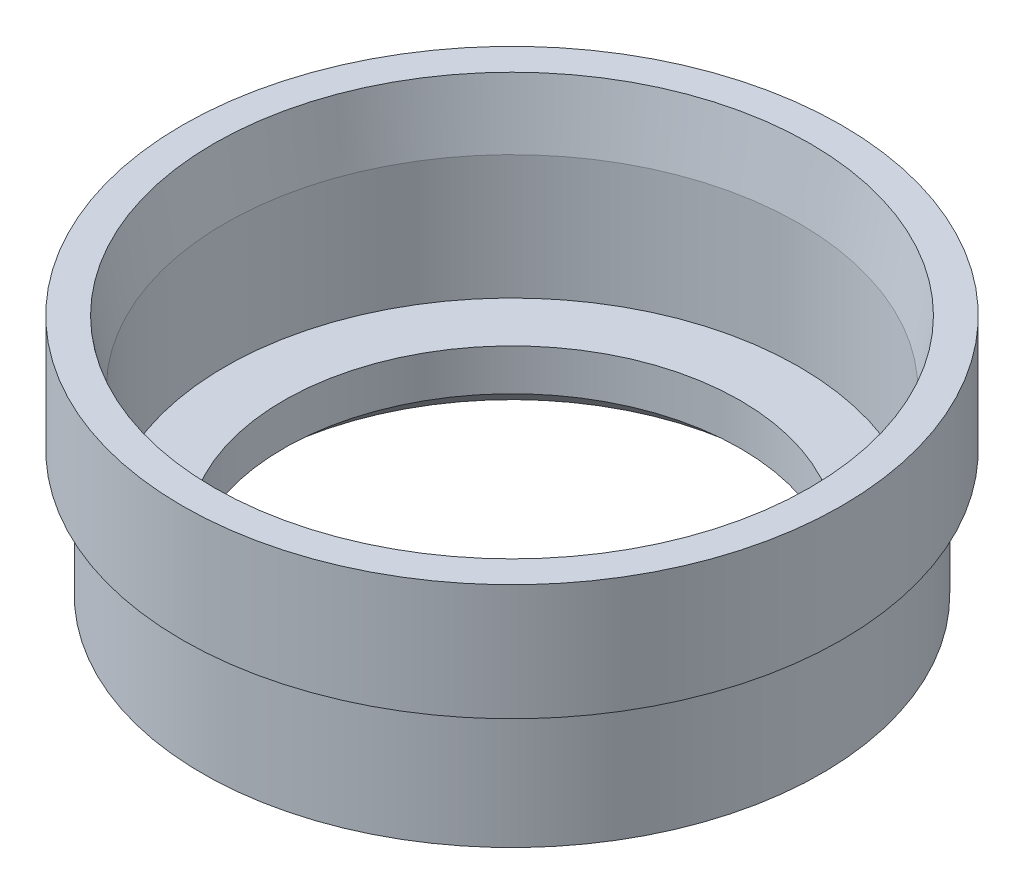
ISO-10303-21;
HEADER;
FILE_DESCRIPTION(('STEP AP214'),'2;1');
FILE_NAME('part.step','',(''),(''),'','','');
FILE_SCHEMA(('AUTOMOTIVE_DESIGN { 1 0 10303 214 1 1 1 1 }'));
ENDSEC;
DATA;
#1=APPLICATION_CONTEXT('core data for automotive mechanical design processes');
#2=APPLICATION_PROTOCOL_DEFINITION('international standard','automotive_design',2000,#1);
#3=PRODUCT_CONTEXT('',#1,'mechanical');
#4=PRODUCT('Part','Part','',(#3));
#5=PRODUCT_RELATED_PRODUCT_CATEGORY('part','',(#4));
#6=PRODUCT_DEFINITION_FORMATION('','',#4);
#7=PRODUCT_DEFINITION_CONTEXT('part definition',#1,'design');
#8=PRODUCT_DEFINITION('design','',#6,#7);
#9=PRODUCT_DEFINITION_SHAPE('','',#8);
#10=(LENGTH_UNIT() NAMED_UNIT(*) SI_UNIT(.MILLI.,.METRE.));
#11=(NAMED_UNIT(*) PLANE_ANGLE_UNIT() SI_UNIT($,.RADIAN.));
#12=(NAMED_UNIT(*) SI_UNIT($,.STERADIAN.) SOLID_ANGLE_UNIT());
#13=UNCERTAINTY_MEASURE_WITH_UNIT(LENGTH_MEASURE(1.E-05),#10,'distance_accuracy_value','');
#14=(GEOMETRIC_REPRESENTATION_CONTEXT(3) GLOBAL_UNCERTAINTY_ASSIGNED_CONTEXT((#13)) GLOBAL_UNIT_ASSIGNED_CONTEXT((#10,
#11,#12)) REPRESENTATION_CONTEXT('',''));
#15=CARTESIAN_POINT('',(0.,0.,0.));
#16=DIRECTION('',(0.,0.,1.));
#17=DIRECTION('',(1.,0.,0.));
#18=AXIS2_PLACEMENT_3D('',#15,#16,#17);
#19=CARTESIAN_POINT('',(0.,24.0144133538924,0.));
#20=DIRECTION('',(0.,-1.,0.));
#21=DIRECTION('',(0.,0.,-1.));
#22=AXIS2_PLACEMENT_3D('',#19,#20,#21);
#23=PLANE('',#22);
#24=CARTESIAN_POINT('',(-18.7,24.0144133538924,0.));
#25=DIRECTION('',(0.,-1.,0.));
#26=DIRECTION('',(0.,0.,-1.));
#27=AXIS2_PLACEMENT_3D('',#24,#25,#26);
#28=CIRCLE('',#27,27.);
#29=CARTESIAN_POINT('',(-18.7,24.0144133538924,-27.));
#30=VERTEX_POINT('',#29);
#31=EDGE_CURVE('E76',#30,#30,#28,.T.);
#32=ORIENTED_EDGE('',*,*,#31,.F.);
#33=EDGE_LOOP('',(#32));
#34=FACE_BOUND('',#33,.T.);
#35=CARTESIAN_POINT('',(-18.7,24.0144133538924,0.));
#36=DIRECTION('',(0.,-1.,0.));
#37=DIRECTION('',(0.,0.,-1.));
#38=AXIS2_PLACEMENT_3D('',#35,#36,#37);
#39=CIRCLE('',#38,24.4058882382235);
#40=CARTESIAN_POINT('',(-18.7,24.0144133538924,-24.4058882382235));
#41=VERTEX_POINT('',#40);
#42=EDGE_CURVE('E10',#41,#41,#39,.T.);
#43=ORIENTED_EDGE('',*,*,#42,.T.);
#44=EDGE_LOOP('',(#43));
#45=FACE_BOUND('',#44,.T.);
#46=ADVANCED_FACE('F36',(#34,#45),#23,.F.);
#47=CARTESIAN_POINT('',(-18.7,18.8102771556521,0.));
#48=DIRECTION('',(0.,1.,0.));
#49=DIRECTION('',(0.,0.,1.));
#50=AXIS2_PLACEMENT_3D('',#47,#48,#49);
#51=CONICAL_SURFACE('',#50,23.5,0.172343951786383);
#52=ORIENTED_EDGE('',*,*,#42,.F.);
#53=EDGE_LOOP('',(#52));
#54=FACE_BOUND('',#53,.T.);
#55=CARTESIAN_POINT('',(-18.7,18.8102771556521,0.));
#56=DIRECTION('',(0.,-1.,0.));
#57=DIRECTION('',(0.,0.,-1.));
#58=AXIS2_PLACEMENT_3D('',#55,#56,#57);
#59=CIRCLE('',#58,23.5);
#60=CARTESIAN_POINT('',(-18.7,18.8102771556521,-23.5));
#61=VERTEX_POINT('',#60);
#62=EDGE_CURVE('E42',#61,#61,#59,.T.);
#63=ORIENTED_EDGE('',*,*,#62,.T.);
#64=EDGE_LOOP('',(#63));
#65=FACE_BOUND('',#64,.T.);
#66=ADVANCED_FACE('F84',(#54,#65),#51,.F.);
#67=CARTESIAN_POINT('',(-18.7,7.43621261128227,0.));
#68=DIRECTION('',(0.,-1.,0.));
#69=DIRECTION('',(0.,0.,-1.));
#70=AXIS2_PLACEMENT_3D('',#67,#68,#69);
#71=CYLINDRICAL_SURFACE('',#70,23.5);
#72=ORIENTED_EDGE('',*,*,#62,.F.);
#73=EDGE_LOOP('',(#72));
#74=FACE_BOUND('',#73,.T.);
#75=CARTESIAN_POINT('',(-18.7,8.63946186812493,0.));
#76=DIRECTION('',(0.,-1.,0.));
#77=DIRECTION('',(0.,0.,-1.));
#78=AXIS2_PLACEMENT_3D('',#75,#76,#77);
#79=CIRCLE('',#78,23.5);
#80=CARTESIAN_POINT('',(-18.7,8.63946186812493,-23.5));
#81=VERTEX_POINT('',#80);
#82=EDGE_CURVE('E46',#81,#81,#79,.T.);
#83=ORIENTED_EDGE('',*,*,#82,.T.);
#84=EDGE_LOOP('',(#83));
#85=FACE_BOUND('',#84,.T.);
#86=ADVANCED_FACE('F88',(#74,#85),#71,.F.);
#87=CARTESIAN_POINT('',(0.,8.63946186812493,0.));
#88=DIRECTION('',(0.,-1.,0.));
#89=DIRECTION('',(0.,0.,-1.));
#90=AXIS2_PLACEMENT_3D('',#87,#88,#89);
#91=PLANE('',#90);
#92=ORIENTED_EDGE('',*,*,#82,.F.);
#93=EDGE_LOOP('',(#92));
#94=FACE_BOUND('',#93,.T.);
#95=CARTESIAN_POINT('',(-18.7,8.63946186812493,0.));
#96=DIRECTION('',(0.,-1.,0.));
#97=DIRECTION('',(0.,0.,-1.));
#98=AXIS2_PLACEMENT_3D('',#95,#96,#97);
#99=CIRCLE('',#98,18.7);
#100=CARTESIAN_POINT('',(-18.7,8.63946186812493,-18.7));
#101=VERTEX_POINT('',#100);
#102=EDGE_CURVE('E50',#101,#101,#99,.T.);
#103=ORIENTED_EDGE('',*,*,#102,.T.);
#104=EDGE_LOOP('',(#103));
#105=FACE_BOUND('',#104,.T.);
#106=ADVANCED_FACE('F93',(#94,#105),#91,.F.);
#107=CARTESIAN_POINT('',(-18.7,7.43621261128227,0.));
#108=DIRECTION('',(0.,-1.,0.));
#109=DIRECTION('',(0.,0.,-1.));
#110=AXIS2_PLACEMENT_3D('',#107,#108,#109);
#111=CYLINDRICAL_SURFACE('',#110,18.7);
#112=ORIENTED_EDGE('',*,*,#102,.F.);
#113=EDGE_LOOP('',(#112));
#114=FACE_BOUND('',#113,.T.);
#115=CARTESIAN_POINT('',(-18.7,5.24558964556921,0.));
#116=DIRECTION('',(0.,-1.,0.));
#117=DIRECTION('',(0.,0.,-1.));
#118=AXIS2_PLACEMENT_3D('',#115,#116,#117);
#119=CIRCLE('',#118,18.7);
#120=CARTESIAN_POINT('',(-18.7,5.24558964556921,-18.7));
#121=VERTEX_POINT('',#120);
#122=EDGE_CURVE('E55',#121,#121,#119,.T.);
#123=ORIENTED_EDGE('',*,*,#122,.T.);
#124=EDGE_LOOP('',(#123));
#125=FACE_BOUND('',#124,.T.);
#126=ADVANCED_FACE('F99',(#114,#125),#111,.F.);
#127=CARTESIAN_POINT('',(-18.7,3.20559711810254,0.));
#128=DIRECTION('',(0.,-1.,0.));
#129=DIRECTION('',(0.,0.,-1.));
#130=AXIS2_PLACEMENT_3D('',#127,#128,#129);
#131=CONICAL_SURFACE('',#130,20.9961701868477,0.844408917222406);
#132=ORIENTED_EDGE('',*,*,#122,.F.);
#133=EDGE_LOOP('',(#132));
#134=FACE_BOUND('',#133,.T.);
#135=CARTESIAN_POINT('',(-18.7,3.20559711810254,0.));
#136=DIRECTION('',(0.,-1.,0.));
#137=DIRECTION('',(0.,0.,-1.));
#138=AXIS2_PLACEMENT_3D('',#135,#136,#137);
#139=CIRCLE('',#138,20.9961701868477);
#140=CARTESIAN_POINT('',(-18.7,3.20559711810254,-20.9961701868477));
#141=VERTEX_POINT('',#140);
#142=EDGE_CURVE('E58',#141,#141,#139,.T.);
#143=ORIENTED_EDGE('',*,*,#142,.T.);
#144=EDGE_LOOP('',(#143));
#145=FACE_BOUND('',#144,.T.);
#146=ADVANCED_FACE('F103',(#134,#145),#131,.F.);
#147=CARTESIAN_POINT('',(0.,3.20559711810254,0.));
#148=DIRECTION('',(0.,1.,0.));
#149=DIRECTION('',(0.,0.,1.));
#150=AXIS2_PLACEMENT_3D('',#147,#148,#149);
#151=PLANE('',#150);
#152=ORIENTED_EDGE('',*,*,#142,.F.);
#153=EDGE_LOOP('',(#152));
#154=FACE_BOUND('',#153,.T.);
#155=CARTESIAN_POINT('',(-18.7,3.20559711810254,0.));
#156=DIRECTION('',(0.,-1.,0.));
#157=DIRECTION('',(0.,0.,-1.));
#158=AXIS2_PLACEMENT_3D('',#155,#156,#157);
#159=CIRCLE('',#158,22.4961701868477);
#160=CARTESIAN_POINT('',(-18.7,3.20559711810254,-22.4961701868477));
#161=VERTEX_POINT('',#160);
#162=EDGE_CURVE('E61',#161,#161,#159,.T.);
#163=ORIENTED_EDGE('',*,*,#162,.T.);
#164=EDGE_LOOP('',(#163));
#165=FACE_BOUND('',#164,.T.);
#166=ADVANCED_FACE('F107',(#154,#165),#151,.F.);
#167=CARTESIAN_POINT('',(-18.7,7.43621261128227,0.));
#168=DIRECTION('',(0.,-1.,0.));
#169=DIRECTION('',(0.,0.,-1.));
#170=AXIS2_PLACEMENT_3D('',#167,#168,#169);
#171=CYLINDRICAL_SURFACE('',#170,22.4961701868477);
#172=ORIENTED_EDGE('',*,*,#162,.F.);
#173=EDGE_LOOP('',(#172));
#174=FACE_BOUND('',#173,.T.);
#175=CARTESIAN_POINT('',(-18.7,4.20559711810254,0.));
#176=DIRECTION('',(0.,-1.,0.));
#177=DIRECTION('',(0.,0.,-1.));
#178=AXIS2_PLACEMENT_3D('',#175,#176,#177);
#179=CIRCLE('',#178,22.4961701868477);
#180=CARTESIAN_POINT('',(-18.7,4.20559711810254,-22.4961701868477));
#181=VERTEX_POINT('',#180);
#182=EDGE_CURVE('E64',#181,#181,#179,.T.);
#183=ORIENTED_EDGE('',*,*,#182,.T.);
#184=EDGE_LOOP('',(#183));
#185=FACE_BOUND('',#184,.T.);
#186=ADVANCED_FACE('F111',(#174,#185),#171,.T.);
#187=CARTESIAN_POINT('',(0.,4.20559711810254,0.));
#188=DIRECTION('',(0.,1.,0.));
#189=DIRECTION('',(0.,0.,1.));
#190=AXIS2_PLACEMENT_3D('',#187,#188,#189);
#191=PLANE('',#190);
#192=ORIENTED_EDGE('',*,*,#182,.F.);
#193=EDGE_LOOP('',(#192));
#194=FACE_BOUND('',#193,.T.);
#195=CARTESIAN_POINT('',(-18.7,4.20559711810254,0.));
#196=DIRECTION('',(0.,-1.,0.));
#197=DIRECTION('',(0.,0.,-1.));
#198=AXIS2_PLACEMENT_3D('',#195,#196,#197);
#199=CIRCLE('',#198,25.35);
#200=CARTESIAN_POINT('',(-18.7,4.20559711810254,-25.35));
#201=VERTEX_POINT('',#200);
#202=EDGE_CURVE('E67',#201,#201,#199,.T.);
#203=ORIENTED_EDGE('',*,*,#202,.T.);
#204=EDGE_LOOP('',(#203));
#205=FACE_BOUND('',#204,.T.);
#206=ADVANCED_FACE('F115',(#194,#205),#191,.F.);
#207=CARTESIAN_POINT('',(-18.7,7.43621261128227,0.));
#208=DIRECTION('',(0.,-1.,0.));
#209=DIRECTION('',(0.,0.,-1.));
#210=AXIS2_PLACEMENT_3D('',#207,#208,#209);
#211=CYLINDRICAL_SURFACE('',#210,25.35);
#212=ORIENTED_EDGE('',*,*,#202,.F.);
#213=EDGE_LOOP('',(#212));
#214=FACE_BOUND('',#213,.T.);
#215=CARTESIAN_POINT('',(-18.7,14.5055971181025,0.));
#216=DIRECTION('',(0.,-1.,0.));
#217=DIRECTION('',(0.,0.,-1.));
#218=AXIS2_PLACEMENT_3D('',#215,#216,#217);
#219=CIRCLE('',#218,25.35);
#220=CARTESIAN_POINT('',(-18.7,14.5055971181025,-25.35));
#221=VERTEX_POINT('',#220);
#222=EDGE_CURVE('E70',#221,#221,#219,.T.);
#223=ORIENTED_EDGE('',*,*,#222,.T.);
#224=EDGE_LOOP('',(#223));
#225=FACE_BOUND('',#224,.T.);
#226=ADVANCED_FACE('F119',(#214,#225),#211,.T.);
#227=CARTESIAN_POINT('',(0.,14.5055971181025,0.));
#228=DIRECTION('',(0.,-1.,0.));
#229=DIRECTION('',(0.,0.,-1.));
#230=AXIS2_PLACEMENT_3D('',#227,#228,#229);
#231=PLANE('',#230);
#232=CARTESIAN_POINT('',(-18.7,14.5055971181025,0.));
#233=DIRECTION('',(0.,-1.,0.));
#234=DIRECTION('',(0.,0.,-1.));
#235=AXIS2_PLACEMENT_3D('',#232,#233,#234);
#236=CIRCLE('',#235,27.);
#237=CARTESIAN_POINT('',(-18.7,14.5055971181025,-27.));
#238=VERTEX_POINT('',#237);
#239=EDGE_CURVE('E73',#238,#238,#236,.T.);
#240=ORIENTED_EDGE('',*,*,#239,.T.);
#241=EDGE_LOOP('',(#240));
#242=FACE_BOUND('',#241,.T.);
#243=ORIENTED_EDGE('',*,*,#222,.F.);
#244=EDGE_LOOP('',(#243));
#245=FACE_BOUND('',#244,.T.);
#246=ADVANCED_FACE('F123',(#242,#245),#231,.T.);
#247=CARTESIAN_POINT('',(-18.7,7.43621261128227,0.));
#248=DIRECTION('',(0.,-1.,0.));
#249=DIRECTION('',(0.,0.,-1.));
#250=AXIS2_PLACEMENT_3D('',#247,#248,#249);
#251=CYLINDRICAL_SURFACE('',#250,27.);
#252=ORIENTED_EDGE('',*,*,#31,.T.);
#253=EDGE_LOOP('',(#252));
#254=FACE_BOUND('',#253,.T.);
#255=ORIENTED_EDGE('',*,*,#239,.F.);
#256=EDGE_LOOP('',(#255));
#257=FACE_BOUND('',#256,.T.);
#258=ADVANCED_FACE('F80',(#254,#257),#251,.T.);
#259=CLOSED_SHELL('',(#46,#66,#86,#106,#126,#146,#166,#186,#206,#226,#246,#258));
#260=MANIFOLD_SOLID_BREP('B2',#259);
#261=ADVANCED_BREP_SHAPE_REPRESENTATION('',(#18,#260),#14);
#262=SHAPE_DEFINITION_REPRESENTATION(#9,#261);
ENDSEC;
END-ISO-10303-21;
